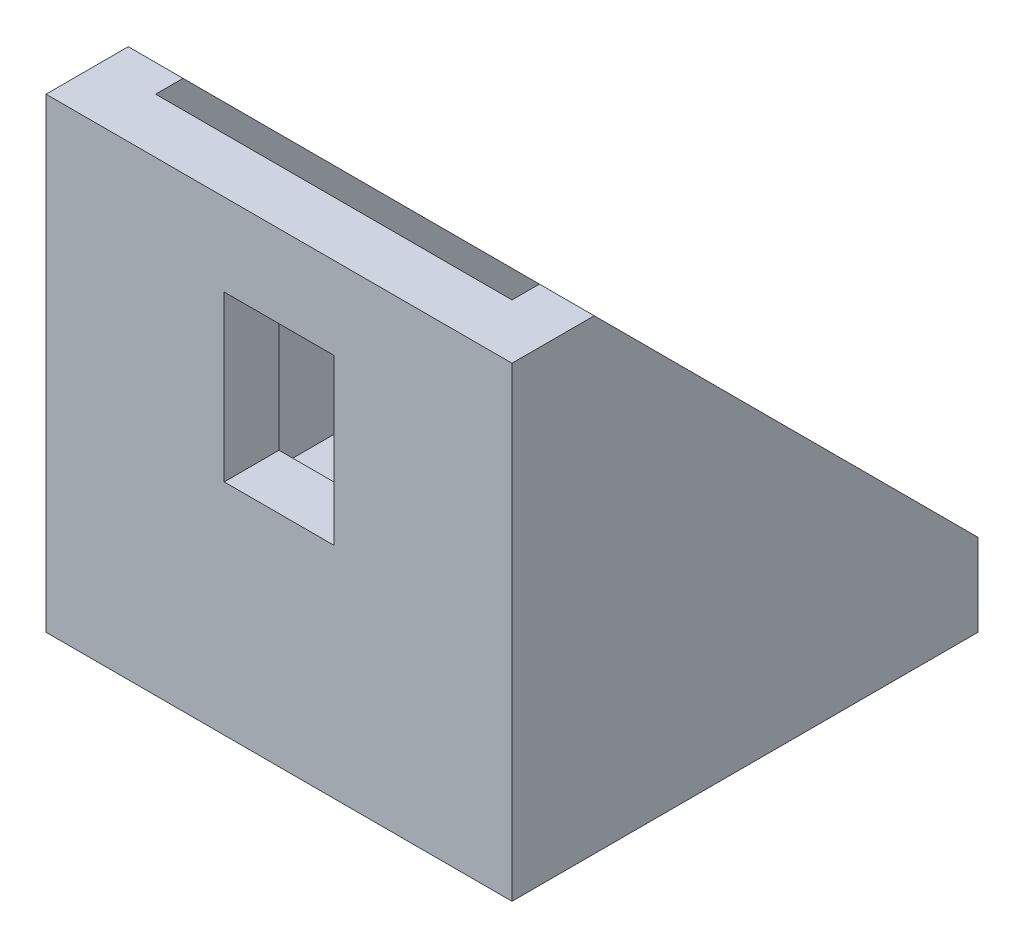
ISO-10303-21;
HEADER;
FILE_DESCRIPTION(('STEP AP214'),'2;1');
FILE_NAME('part.step','',(''),(''),'','','');
FILE_SCHEMA(('AUTOMOTIVE_DESIGN { 1 0 10303 214 1 1 1 1 }'));
ENDSEC;
DATA;
#1=APPLICATION_CONTEXT('core data for automotive mechanical design processes');
#2=APPLICATION_PROTOCOL_DEFINITION('international standard','automotive_design',2000,#1);
#3=PRODUCT_CONTEXT('',#1,'mechanical');
#4=PRODUCT('Part','Part','',(#3));
#5=PRODUCT_RELATED_PRODUCT_CATEGORY('part','',(#4));
#6=PRODUCT_DEFINITION_FORMATION('','',#4);
#7=PRODUCT_DEFINITION_CONTEXT('part definition',#1,'design');
#8=PRODUCT_DEFINITION('design','',#6,#7);
#9=PRODUCT_DEFINITION_SHAPE('','',#8);
#10=(LENGTH_UNIT() NAMED_UNIT(*) SI_UNIT(.MILLI.,.METRE.));
#11=(NAMED_UNIT(*) PLANE_ANGLE_UNIT() SI_UNIT($,.RADIAN.));
#12=(NAMED_UNIT(*) SI_UNIT($,.STERADIAN.) SOLID_ANGLE_UNIT());
#13=UNCERTAINTY_MEASURE_WITH_UNIT(LENGTH_MEASURE(1.E-05),#10,'distance_accuracy_value','');
#14=(GEOMETRIC_REPRESENTATION_CONTEXT(3) GLOBAL_UNCERTAINTY_ASSIGNED_CONTEXT((#13)) GLOBAL_UNIT_ASSIGNED_CONTEXT((#10,
#11,#12)) REPRESENTATION_CONTEXT('',''));
#15=CARTESIAN_POINT('',(0.,0.,0.));
#16=DIRECTION('',(0.,0.,1.));
#17=DIRECTION('',(1.,0.,0.));
#18=AXIS2_PLACEMENT_3D('',#15,#16,#17);
#19=CARTESIAN_POINT('',(8.5,3.,-17.));
#20=DIRECTION('',(0.,-0.707106781186547,0.707106781186548));
#21=DIRECTION('',(0.,-0.707106781186548,-0.707106781186547));
#22=AXIS2_PLACEMENT_3D('',#19,#20,#21);
#23=PLANE('',#22);
#24=DIRECTION('',(-1.,0.,0.));
#25=VECTOR('',#24,1.);
#26=CARTESIAN_POINT('',(8.5,3.,-17.));
#27=LINE('',#26,#25);
#28=CARTESIAN_POINT('',(8.5,3.,-17.));
#29=VERTEX_POINT('',#28);
#30=CARTESIAN_POINT('',(6.5,3.,-17.));
#31=VERTEX_POINT('',#30);
#32=EDGE_CURVE('E325',#29,#31,#27,.T.);
#33=ORIENTED_EDGE('',*,*,#32,.T.);
#34=DIRECTION('',(0.,0.707106781186548,0.707106781186547));
#35=VECTOR('',#34,1.);
#36=CARTESIAN_POINT('',(6.5,3.,-17.));
#37=LINE('',#36,#35);
#38=CARTESIAN_POINT('',(6.5,17.,-3.));
#39=VERTEX_POINT('',#38);
#40=EDGE_CURVE('E287',#31,#39,#37,.T.);
#41=ORIENTED_EDGE('',*,*,#40,.T.);
#42=DIRECTION('',(-1.,0.,0.));
#43=VECTOR('',#42,1.);
#44=CARTESIAN_POINT('',(8.5,17.,-3.));
#45=LINE('',#44,#43);
#46=CARTESIAN_POINT('',(8.5,17.,-3.));
#47=VERTEX_POINT('',#46);
#48=EDGE_CURVE('E12',#47,#39,#45,.T.);
#49=ORIENTED_EDGE('',*,*,#48,.F.);
#50=DIRECTION('',(0.,0.707106781186547,0.707106781186547));
#51=VECTOR('',#50,1.);
#52=CARTESIAN_POINT('',(8.5,3.,-17.));
#53=LINE('',#52,#51);
#54=EDGE_CURVE('E292',#29,#47,#53,.T.);
#55=ORIENTED_EDGE('',*,*,#54,.F.);
#56=EDGE_LOOP('',(#33,#41,#49,#55));
#57=FACE_BOUND('',#56,.T.);
#58=ADVANCED_FACE('F41',(#57),#23,.F.);
#59=CARTESIAN_POINT('',(-6.5,17.,-3.));
#60=VERTEX_POINT('',#59);
#61=CARTESIAN_POINT('',(-8.5,17.,-3.));
#62=VERTEX_POINT('',#61);
#63=EDGE_CURVE('E50',#60,#62,#45,.T.);
#64=ORIENTED_EDGE('',*,*,#63,.F.);
#65=DIRECTION('',(0.,-0.707106781186548,-0.707106781186547));
#66=VECTOR('',#65,1.);
#67=CARTESIAN_POINT('',(-6.5,3.,-17.));
#68=LINE('',#67,#66);
#69=CARTESIAN_POINT('',(-6.5,3.,-17.));
#70=VERTEX_POINT('',#69);
#71=EDGE_CURVE('E283',#60,#70,#68,.T.);
#72=ORIENTED_EDGE('',*,*,#71,.T.);
#73=CARTESIAN_POINT('',(-8.5,3.,-17.));
#74=VERTEX_POINT('',#73);
#75=EDGE_CURVE('E309',#70,#74,#27,.T.);
#76=ORIENTED_EDGE('',*,*,#75,.T.);
#77=DIRECTION('',(0.,0.707106781186547,0.707106781186547));
#78=VECTOR('',#77,1.);
#79=CARTESIAN_POINT('',(-8.5,3.,-17.));
#80=LINE('',#79,#78);
#81=EDGE_CURVE('E291',#74,#62,#80,.T.);
#82=ORIENTED_EDGE('',*,*,#81,.T.);
#83=EDGE_LOOP('',(#64,#72,#76,#82));
#84=FACE_BOUND('',#83,.T.);
#85=ADVANCED_FACE('F43',(#84),#23,.F.);
#86=CARTESIAN_POINT('',(8.5,17.,-3.));
#87=DIRECTION('',(0.,-1.,0.));
#88=DIRECTION('',(0.,0.,-1.));
#89=AXIS2_PLACEMENT_3D('',#86,#87,#88);
#90=PLANE('',#89);
#91=ORIENTED_EDGE('',*,*,#48,.T.);
#92=DIRECTION('',(0.,0.,-1.));
#93=VECTOR('',#92,1.);
#94=CARTESIAN_POINT('',(6.5,17.,19.1049731745428));
#95=LINE('',#94,#93);
#96=CARTESIAN_POINT('',(6.5,17.,-2.));
#97=VERTEX_POINT('',#96);
#98=EDGE_CURVE('E258',#97,#39,#95,.T.);
#99=ORIENTED_EDGE('',*,*,#98,.F.);
#100=DIRECTION('',(-1.,0.,0.));
#101=VECTOR('',#100,1.);
#102=CARTESIAN_POINT('',(6.5,17.,-2.));
#103=LINE('',#102,#101);
#104=CARTESIAN_POINT('',(-6.5,17.,-2.));
#105=VERTEX_POINT('',#104);
#106=EDGE_CURVE('E257',#97,#105,#103,.T.);
#107=ORIENTED_EDGE('',*,*,#106,.T.);
#108=DIRECTION('',(0.,0.,-1.));
#109=VECTOR('',#108,1.);
#110=CARTESIAN_POINT('',(-6.5,17.,19.1049731745428));
#111=LINE('',#110,#109);
#112=EDGE_CURVE('E272',#105,#60,#111,.T.);
#113=ORIENTED_EDGE('',*,*,#112,.T.);
#114=ORIENTED_EDGE('',*,*,#63,.T.);
#115=DIRECTION('',(0.,0.,1.));
#116=VECTOR('',#115,1.);
#117=CARTESIAN_POINT('',(-8.5,17.,-3.));
#118=LINE('',#117,#116);
#119=CARTESIAN_POINT('',(-8.5,17.,0.));
#120=VERTEX_POINT('',#119);
#121=EDGE_CURVE('E313',#62,#120,#118,.T.);
#122=ORIENTED_EDGE('',*,*,#121,.T.);
#123=DIRECTION('',(-1.,0.,0.));
#124=VECTOR('',#123,1.);
#125=CARTESIAN_POINT('',(8.5,17.,0.));
#126=LINE('',#125,#124);
#127=CARTESIAN_POINT('',(8.5,17.,0.));
#128=VERTEX_POINT('',#127);
#129=EDGE_CURVE('E336',#128,#120,#126,.T.);
#130=ORIENTED_EDGE('',*,*,#129,.F.);
#131=DIRECTION('',(0.,0.,1.));
#132=VECTOR('',#131,1.);
#133=CARTESIAN_POINT('',(8.5,17.,-3.));
#134=LINE('',#133,#132);
#135=EDGE_CURVE('E296',#47,#128,#134,.T.);
#136=ORIENTED_EDGE('',*,*,#135,.F.);
#137=EDGE_LOOP('',(#91,#99,#107,#113,#114,#122,#130,#136));
#138=FACE_BOUND('',#137,.T.);
#139=ADVANCED_FACE('F347',(#138),#90,.F.);
#140=CARTESIAN_POINT('',(8.5,17.,0.));
#141=DIRECTION('',(0.,0.,-1.));
#142=DIRECTION('',(0.,1.,0.));
#143=AXIS2_PLACEMENT_3D('',#140,#141,#142);
#144=PLANE('',#143);
#145=DIRECTION('',(-1.,0.,0.));
#146=VECTOR('',#145,1.);
#147=CARTESIAN_POINT('',(-2.,8.,0.));
#148=LINE('',#147,#146);
#149=CARTESIAN_POINT('',(2.,8.,0.));
#150=VERTEX_POINT('',#149);
#151=CARTESIAN_POINT('',(-2.,8.,0.));
#152=VERTEX_POINT('',#151);
#153=EDGE_CURVE('E223',#150,#152,#148,.T.);
#154=ORIENTED_EDGE('',*,*,#153,.T.);
#155=DIRECTION('',(0.,1.,0.));
#156=VECTOR('',#155,1.);
#157=CARTESIAN_POINT('',(-2.,8.,0.));
#158=LINE('',#157,#156);
#159=CARTESIAN_POINT('',(-2.,14.,0.));
#160=VERTEX_POINT('',#159);
#161=EDGE_CURVE('E210',#152,#160,#158,.T.);
#162=ORIENTED_EDGE('',*,*,#161,.T.);
#163=DIRECTION('',(1.,0.,0.));
#164=VECTOR('',#163,1.);
#165=CARTESIAN_POINT('',(-2.,14.,0.));
#166=LINE('',#165,#164);
#167=CARTESIAN_POINT('',(2.,14.,0.));
#168=VERTEX_POINT('',#167);
#169=EDGE_CURVE('E214',#160,#168,#166,.T.);
#170=ORIENTED_EDGE('',*,*,#169,.T.);
#171=DIRECTION('',(0.,-1.,0.));
#172=VECTOR('',#171,1.);
#173=CARTESIAN_POINT('',(2.,8.,0.));
#174=LINE('',#173,#172);
#175=EDGE_CURVE('E219',#168,#150,#174,.T.);
#176=ORIENTED_EDGE('',*,*,#175,.T.);
#177=EDGE_LOOP('',(#154,#162,#170,#176));
#178=FACE_BOUND('',#177,.T.);
#179=DIRECTION('',(0.,-1.,0.));
#180=VECTOR('',#179,1.);
#181=CARTESIAN_POINT('',(-8.5,17.,0.));
#182=LINE('',#181,#180);
#183=CARTESIAN_POINT('',(-8.5,0.,0.));
#184=VERTEX_POINT('',#183);
#185=EDGE_CURVE('E316',#120,#184,#182,.T.);
#186=ORIENTED_EDGE('',*,*,#185,.T.);
#187=DIRECTION('',(-1.,0.,0.));
#188=VECTOR('',#187,1.);
#189=CARTESIAN_POINT('',(8.5,0.,0.));
#190=LINE('',#189,#188);
#191=CARTESIAN_POINT('',(8.5,0.,0.));
#192=VERTEX_POINT('',#191);
#193=EDGE_CURVE('E333',#192,#184,#190,.T.);
#194=ORIENTED_EDGE('',*,*,#193,.F.);
#195=DIRECTION('',(0.,-1.,0.));
#196=VECTOR('',#195,1.);
#197=CARTESIAN_POINT('',(8.5,17.,0.));
#198=LINE('',#197,#196);
#199=EDGE_CURVE('E300',#128,#192,#198,.T.);
#200=ORIENTED_EDGE('',*,*,#199,.F.);
#201=ORIENTED_EDGE('',*,*,#129,.T.);
#202=EDGE_LOOP('',(#186,#194,#200,#201));
#203=FACE_BOUND('',#202,.T.);
#204=ADVANCED_FACE('F366',(#178,#203),#144,.F.);
#205=CARTESIAN_POINT('',(8.5,0.,0.));
#206=DIRECTION('',(0.,1.,0.));
#207=DIRECTION('',(0.,0.,1.));
#208=AXIS2_PLACEMENT_3D('',#205,#206,#207);
#209=PLANE('',#208);
#210=DIRECTION('',(-1.,0.,0.));
#211=VECTOR('',#210,1.);
#212=CARTESIAN_POINT('',(8.5,0.,-14.));
#213=LINE('',#212,#211);
#214=CARTESIAN_POINT('',(2.,0.,-14.));
#215=VERTEX_POINT('',#214);
#216=CARTESIAN_POINT('',(-2.,0.,-14.));
#217=VERTEX_POINT('',#216);
#218=EDGE_CURVE('E201',#215,#217,#213,.T.);
#219=ORIENTED_EDGE('',*,*,#218,.T.);
#220=DIRECTION('',(0.,0.,1.));
#221=VECTOR('',#220,1.);
#222=CARTESIAN_POINT('',(-2.,0.,0.));
#223=LINE('',#222,#221);
#224=CARTESIAN_POINT('',(-2.,0.,-8.));
#225=VERTEX_POINT('',#224);
#226=EDGE_CURVE('E205',#217,#225,#223,.T.);
#227=ORIENTED_EDGE('',*,*,#226,.T.);
#228=DIRECTION('',(1.,0.,0.));
#229=VECTOR('',#228,1.);
#230=CARTESIAN_POINT('',(8.5,0.,-8.));
#231=LINE('',#230,#229);
#232=CARTESIAN_POINT('',(2.,0.,-8.));
#233=VERTEX_POINT('',#232);
#234=EDGE_CURVE('E192',#225,#233,#231,.T.);
#235=ORIENTED_EDGE('',*,*,#234,.T.);
#236=DIRECTION('',(0.,0.,-1.));
#237=VECTOR('',#236,1.);
#238=CARTESIAN_POINT('',(2.,0.,0.));
#239=LINE('',#238,#237);
#240=EDGE_CURVE('E167',#233,#215,#239,.T.);
#241=ORIENTED_EDGE('',*,*,#240,.T.);
#242=EDGE_LOOP('',(#219,#227,#235,#241));
#243=FACE_BOUND('',#242,.T.);
#244=DIRECTION('',(0.,0.,-1.));
#245=VECTOR('',#244,1.);
#246=CARTESIAN_POINT('',(-8.5,0.,0.));
#247=LINE('',#246,#245);
#248=CARTESIAN_POINT('',(-8.5,0.,-17.));
#249=VERTEX_POINT('',#248);
#250=EDGE_CURVE('E319',#184,#249,#247,.T.);
#251=ORIENTED_EDGE('',*,*,#250,.T.);
#252=DIRECTION('',(-1.,0.,0.));
#253=VECTOR('',#252,1.);
#254=CARTESIAN_POINT('',(8.5,0.,-17.));
#255=LINE('',#254,#253);
#256=CARTESIAN_POINT('',(8.5,0.,-17.));
#257=VERTEX_POINT('',#256);
#258=EDGE_CURVE('E329',#257,#249,#255,.T.);
#259=ORIENTED_EDGE('',*,*,#258,.F.);
#260=DIRECTION('',(0.,0.,-1.));
#261=VECTOR('',#260,1.);
#262=CARTESIAN_POINT('',(8.5,0.,0.));
#263=LINE('',#262,#261);
#264=EDGE_CURVE('E303',#192,#257,#263,.T.);
#265=ORIENTED_EDGE('',*,*,#264,.F.);
#266=ORIENTED_EDGE('',*,*,#193,.T.);
#267=EDGE_LOOP('',(#251,#259,#265,#266));
#268=FACE_BOUND('',#267,.T.);
#269=ADVANCED_FACE('F363',(#243,#268),#209,.F.);
#270=CARTESIAN_POINT('',(8.5,0.,-17.));
#271=DIRECTION('',(0.,0.,1.));
#272=DIRECTION('',(1.,0.,0.));
#273=AXIS2_PLACEMENT_3D('',#270,#271,#272);
#274=PLANE('',#273);
#275=DIRECTION('',(0.,1.,0.));
#276=VECTOR('',#275,1.);
#277=CARTESIAN_POINT('',(-8.5,0.,-17.));
#278=LINE('',#277,#276);
#279=EDGE_CURVE('E297',#249,#74,#278,.T.);
#280=ORIENTED_EDGE('',*,*,#279,.T.);
#281=ORIENTED_EDGE('',*,*,#75,.F.);
#282=DIRECTION('',(-1.,0.,0.));
#283=VECTOR('',#282,1.);
#284=CARTESIAN_POINT('',(6.5,3.,-17.));
#285=LINE('',#284,#283);
#286=EDGE_CURVE('E244',#31,#70,#285,.T.);
#287=ORIENTED_EDGE('',*,*,#286,.F.);
#288=ORIENTED_EDGE('',*,*,#32,.F.);
#289=DIRECTION('',(0.,1.,0.));
#290=VECTOR('',#289,1.);
#291=CARTESIAN_POINT('',(8.5,0.,-17.));
#292=LINE('',#291,#290);
#293=EDGE_CURVE('E306',#257,#29,#292,.T.);
#294=ORIENTED_EDGE('',*,*,#293,.F.);
#295=ORIENTED_EDGE('',*,*,#258,.T.);
#296=EDGE_LOOP('',(#280,#281,#287,#288,#294,#295));
#297=FACE_BOUND('',#296,.T.);
#298=ADVANCED_FACE('F359',(#297),#274,.F.);
#299=CARTESIAN_POINT('',(8.5,0.,0.));
#300=DIRECTION('',(1.,0.,0.));
#301=DIRECTION('',(0.,0.,-1.));
#302=AXIS2_PLACEMENT_3D('',#299,#300,#301);
#303=PLANE('',#302);
#304=ORIENTED_EDGE('',*,*,#54,.T.);
#305=ORIENTED_EDGE('',*,*,#135,.T.);
#306=ORIENTED_EDGE('',*,*,#199,.T.);
#307=ORIENTED_EDGE('',*,*,#264,.T.);
#308=ORIENTED_EDGE('',*,*,#293,.T.);
#309=EDGE_LOOP('',(#304,#305,#306,#307,#308));
#310=FACE_BOUND('',#309,.T.);
#311=ADVANCED_FACE('F368',(#310),#303,.T.);
#312=CARTESIAN_POINT('',(-8.5,0.,0.));
#313=DIRECTION('',(1.,0.,0.));
#314=DIRECTION('',(0.,0.,-1.));
#315=AXIS2_PLACEMENT_3D('',#312,#313,#314);
#316=PLANE('',#315);
#317=ORIENTED_EDGE('',*,*,#81,.F.);
#318=ORIENTED_EDGE('',*,*,#279,.F.);
#319=ORIENTED_EDGE('',*,*,#250,.F.);
#320=ORIENTED_EDGE('',*,*,#185,.F.);
#321=ORIENTED_EDGE('',*,*,#121,.F.);
#322=EDGE_LOOP('',(#317,#318,#319,#320,#321));
#323=FACE_BOUND('',#322,.T.);
#324=ADVANCED_FACE('F352',(#323),#316,.F.);
#325=CARTESIAN_POINT('',(6.5,3.,19.1049731745428));
#326=DIRECTION('',(1.,0.,0.));
#327=DIRECTION('',(0.,0.,-1.));
#328=AXIS2_PLACEMENT_3D('',#325,#326,#327);
#329=PLANE('',#328);
#330=DIRECTION('',(0.,0.,-1.));
#331=VECTOR('',#330,1.);
#332=CARTESIAN_POINT('',(6.5,3.,19.1049731745428));
#333=LINE('',#332,#331);
#334=CARTESIAN_POINT('',(6.5,3.,-2.));
#335=VERTEX_POINT('',#334);
#336=EDGE_CURVE('E269',#335,#31,#333,.T.);
#337=ORIENTED_EDGE('',*,*,#336,.F.);
#338=DIRECTION('',(0.,1.,0.));
#339=VECTOR('',#338,1.);
#340=CARTESIAN_POINT('',(6.5,3.,-2.));
#341=LINE('',#340,#339);
#342=EDGE_CURVE('E262',#335,#97,#341,.T.);
#343=ORIENTED_EDGE('',*,*,#342,.T.);
#344=ORIENTED_EDGE('',*,*,#98,.T.);
#345=ORIENTED_EDGE('',*,*,#40,.F.);
#346=EDGE_LOOP('',(#337,#343,#344,#345));
#347=FACE_BOUND('',#346,.T.);
#348=ADVANCED_FACE('F377',(#347),#329,.F.);
#349=CARTESIAN_POINT('',(-6.5,3.,19.1049731745428));
#350=DIRECTION('',(-1.,0.,0.));
#351=DIRECTION('',(0.,0.,1.));
#352=AXIS2_PLACEMENT_3D('',#349,#350,#351);
#353=PLANE('',#352);
#354=ORIENTED_EDGE('',*,*,#112,.F.);
#355=DIRECTION('',(0.,-1.,0.));
#356=VECTOR('',#355,1.);
#357=CARTESIAN_POINT('',(-6.5,3.,-2.));
#358=LINE('',#357,#356);
#359=CARTESIAN_POINT('',(-6.5,3.,-2.));
#360=VERTEX_POINT('',#359);
#361=EDGE_CURVE('E254',#105,#360,#358,.T.);
#362=ORIENTED_EDGE('',*,*,#361,.T.);
#363=DIRECTION('',(0.,0.,-1.));
#364=VECTOR('',#363,1.);
#365=CARTESIAN_POINT('',(-6.5,3.,19.1049731745428));
#366=LINE('',#365,#364);
#367=EDGE_CURVE('E276',#360,#70,#366,.T.);
#368=ORIENTED_EDGE('',*,*,#367,.T.);
#369=ORIENTED_EDGE('',*,*,#71,.F.);
#370=EDGE_LOOP('',(#354,#362,#368,#369));
#371=FACE_BOUND('',#370,.T.);
#372=ADVANCED_FACE('F385',(#371),#353,.F.);
#373=CARTESIAN_POINT('',(6.5,3.,19.1049731745428));
#374=DIRECTION('',(0.,-1.,0.));
#375=DIRECTION('',(0.,0.,-1.));
#376=AXIS2_PLACEMENT_3D('',#373,#374,#375);
#377=PLANE('',#376);
#378=DIRECTION('',(1.,0.,0.));
#379=VECTOR('',#378,1.);
#380=CARTESIAN_POINT('',(-2.,3.,-8.));
#381=LINE('',#380,#379);
#382=CARTESIAN_POINT('',(-2.,3.,-8.));
#383=VERTEX_POINT('',#382);
#384=CARTESIAN_POINT('',(2.,3.,-8.));
#385=VERTEX_POINT('',#384);
#386=EDGE_CURVE('E174',#383,#385,#381,.T.);
#387=ORIENTED_EDGE('',*,*,#386,.F.);
#388=DIRECTION('',(0.,0.,1.));
#389=VECTOR('',#388,1.);
#390=CARTESIAN_POINT('',(-2.,3.,-8.));
#391=LINE('',#390,#389);
#392=CARTESIAN_POINT('',(-2.,3.,-14.));
#393=VERTEX_POINT('',#392);
#394=EDGE_CURVE('E65',#393,#383,#391,.T.);
#395=ORIENTED_EDGE('',*,*,#394,.F.);
#396=DIRECTION('',(-1.,0.,0.));
#397=VECTOR('',#396,1.);
#398=CARTESIAN_POINT('',(-2.,3.,-14.));
#399=LINE('',#398,#397);
#400=CARTESIAN_POINT('',(2.,3.,-14.));
#401=VERTEX_POINT('',#400);
#402=EDGE_CURVE('E182',#401,#393,#399,.T.);
#403=ORIENTED_EDGE('',*,*,#402,.F.);
#404=DIRECTION('',(0.,0.,-1.));
#405=VECTOR('',#404,1.);
#406=CARTESIAN_POINT('',(2.,3.,-8.));
#407=LINE('',#406,#405);
#408=EDGE_CURVE('E164',#385,#401,#407,.T.);
#409=ORIENTED_EDGE('',*,*,#408,.F.);
#410=EDGE_LOOP('',(#387,#395,#403,#409));
#411=FACE_BOUND('',#410,.T.);
#412=DIRECTION('',(1.,0.,0.));
#413=VECTOR('',#412,1.);
#414=CARTESIAN_POINT('',(6.5,3.,-2.));
#415=LINE('',#414,#413);
#416=EDGE_CURVE('E265',#360,#335,#415,.T.);
#417=ORIENTED_EDGE('',*,*,#416,.T.);
#418=ORIENTED_EDGE('',*,*,#336,.T.);
#419=ORIENTED_EDGE('',*,*,#286,.T.);
#420=ORIENTED_EDGE('',*,*,#367,.F.);
#421=EDGE_LOOP('',(#417,#418,#419,#420));
#422=FACE_BOUND('',#421,.T.);
#423=ADVANCED_FACE('F179',(#411,#422),#377,.F.);
#424=CARTESIAN_POINT('',(8.5,17.,-2.));
#425=DIRECTION('',(0.,0.,-1.));
#426=DIRECTION('',(0.,1.,0.));
#427=AXIS2_PLACEMENT_3D('',#424,#425,#426);
#428=PLANE('',#427);
#429=DIRECTION('',(0.,1.,0.));
#430=VECTOR('',#429,1.);
#431=CARTESIAN_POINT('',(-2.,8.,-2.));
#432=LINE('',#431,#430);
#433=CARTESIAN_POINT('',(-2.,8.,-2.));
#434=VERTEX_POINT('',#433);
#435=CARTESIAN_POINT('',(-2.,14.,-2.));
#436=VERTEX_POINT('',#435);
#437=EDGE_CURVE('E209',#434,#436,#432,.T.);
#438=ORIENTED_EDGE('',*,*,#437,.F.);
#439=DIRECTION('',(-1.,0.,0.));
#440=VECTOR('',#439,1.);
#441=CARTESIAN_POINT('',(-2.,8.,-2.));
#442=LINE('',#441,#440);
#443=CARTESIAN_POINT('',(2.,8.,-2.));
#444=VERTEX_POINT('',#443);
#445=EDGE_CURVE('E215',#444,#434,#442,.T.);
#446=ORIENTED_EDGE('',*,*,#445,.F.);
#447=DIRECTION('',(0.,-1.,0.));
#448=VECTOR('',#447,1.);
#449=CARTESIAN_POINT('',(2.,8.,-2.));
#450=LINE('',#449,#448);
#451=CARTESIAN_POINT('',(2.,14.,-2.));
#452=VERTEX_POINT('',#451);
#453=EDGE_CURVE('E234',#452,#444,#450,.T.);
#454=ORIENTED_EDGE('',*,*,#453,.F.);
#455=DIRECTION('',(1.,0.,0.));
#456=VECTOR('',#455,1.);
#457=CARTESIAN_POINT('',(-2.,14.,-2.));
#458=LINE('',#457,#456);
#459=EDGE_CURVE('E230',#436,#452,#458,.T.);
#460=ORIENTED_EDGE('',*,*,#459,.F.);
#461=EDGE_LOOP('',(#438,#446,#454,#460));
#462=FACE_BOUND('',#461,.T.);
#463=ORIENTED_EDGE('',*,*,#342,.F.);
#464=ORIENTED_EDGE('',*,*,#416,.F.);
#465=ORIENTED_EDGE('',*,*,#361,.F.);
#466=ORIENTED_EDGE('',*,*,#106,.F.);
#467=EDGE_LOOP('',(#463,#464,#465,#466));
#468=FACE_BOUND('',#467,.T.);
#469=ADVANCED_FACE('F383',(#462,#468),#428,.T.);
#470=CARTESIAN_POINT('',(-2.,8.,0.));
#471=DIRECTION('',(-1.,0.,0.));
#472=DIRECTION('',(0.,0.,1.));
#473=AXIS2_PLACEMENT_3D('',#470,#471,#472);
#474=PLANE('',#473);
#475=ORIENTED_EDGE('',*,*,#437,.T.);
#476=DIRECTION('',(0.,0.,-1.));
#477=VECTOR('',#476,1.);
#478=CARTESIAN_POINT('',(-2.,14.,0.));
#479=LINE('',#478,#477);
#480=EDGE_CURVE('E227',#160,#436,#479,.T.);
#481=ORIENTED_EDGE('',*,*,#480,.F.);
#482=ORIENTED_EDGE('',*,*,#161,.F.);
#483=DIRECTION('',(0.,0.,-1.));
#484=VECTOR('',#483,1.);
#485=CARTESIAN_POINT('',(-2.,8.,0.));
#486=LINE('',#485,#484);
#487=EDGE_CURVE('E241',#152,#434,#486,.T.);
#488=ORIENTED_EDGE('',*,*,#487,.T.);
#489=EDGE_LOOP('',(#475,#481,#482,#488));
#490=FACE_BOUND('',#489,.T.);
#491=ADVANCED_FACE('F453',(#490),#474,.F.);
#492=CARTESIAN_POINT('',(-2.,8.,0.));
#493=DIRECTION('',(0.,-1.,0.));
#494=DIRECTION('',(1.,0.,0.));
#495=AXIS2_PLACEMENT_3D('',#492,#493,#494);
#496=PLANE('',#495);
#497=ORIENTED_EDGE('',*,*,#445,.T.);
#498=ORIENTED_EDGE('',*,*,#487,.F.);
#499=ORIENTED_EDGE('',*,*,#153,.F.);
#500=DIRECTION('',(0.,0.,-1.));
#501=VECTOR('',#500,1.);
#502=CARTESIAN_POINT('',(2.,8.,0.));
#503=LINE('',#502,#501);
#504=EDGE_CURVE('E245',#150,#444,#503,.T.);
#505=ORIENTED_EDGE('',*,*,#504,.T.);
#506=EDGE_LOOP('',(#497,#498,#499,#505));
#507=FACE_BOUND('',#506,.T.);
#508=ADVANCED_FACE('F462',(#507),#496,.F.);
#509=CARTESIAN_POINT('',(2.,8.,0.));
#510=DIRECTION('',(1.,0.,0.));
#511=DIRECTION('',(0.,0.,-1.));
#512=AXIS2_PLACEMENT_3D('',#509,#510,#511);
#513=PLANE('',#512);
#514=ORIENTED_EDGE('',*,*,#453,.T.);
#515=ORIENTED_EDGE('',*,*,#504,.F.);
#516=ORIENTED_EDGE('',*,*,#175,.F.);
#517=DIRECTION('',(0.,0.,-1.));
#518=VECTOR('',#517,1.);
#519=CARTESIAN_POINT('',(2.,14.,0.));
#520=LINE('',#519,#518);
#521=EDGE_CURVE('E248',#168,#452,#520,.T.);
#522=ORIENTED_EDGE('',*,*,#521,.T.);
#523=EDGE_LOOP('',(#514,#515,#516,#522));
#524=FACE_BOUND('',#523,.T.);
#525=ADVANCED_FACE('F472',(#524),#513,.F.);
#526=CARTESIAN_POINT('',(-2.,14.,0.));
#527=DIRECTION('',(0.,1.,0.));
#528=DIRECTION('',(0.,0.,1.));
#529=AXIS2_PLACEMENT_3D('',#526,#527,#528);
#530=PLANE('',#529);
#531=ORIENTED_EDGE('',*,*,#459,.T.);
#532=ORIENTED_EDGE('',*,*,#521,.F.);
#533=ORIENTED_EDGE('',*,*,#169,.F.);
#534=ORIENTED_EDGE('',*,*,#480,.T.);
#535=EDGE_LOOP('',(#531,#532,#533,#534));
#536=FACE_BOUND('',#535,.T.);
#537=ADVANCED_FACE('F482',(#536),#530,.F.);
#538=CARTESIAN_POINT('',(-2.,-14.,-8.));
#539=DIRECTION('',(-1.,0.,0.));
#540=DIRECTION('',(0.,0.,1.));
#541=AXIS2_PLACEMENT_3D('',#538,#539,#540);
#542=PLANE('',#541);
#543=DIRECTION('',(0.,1.,0.));
#544=VECTOR('',#543,1.);
#545=CARTESIAN_POINT('',(-2.,-14.,-14.));
#546=LINE('',#545,#544);
#547=EDGE_CURVE('E189',#217,#393,#546,.T.);
#548=ORIENTED_EDGE('',*,*,#547,.T.);
#549=ORIENTED_EDGE('',*,*,#394,.T.);
#550=DIRECTION('',(0.,1.,0.));
#551=VECTOR('',#550,1.);
#552=CARTESIAN_POINT('',(-2.,-14.,-8.));
#553=LINE('',#552,#551);
#554=EDGE_CURVE('E171',#225,#383,#553,.T.);
#555=ORIENTED_EDGE('',*,*,#554,.F.);
#556=ORIENTED_EDGE('',*,*,#226,.F.);
#557=EDGE_LOOP('',(#548,#549,#555,#556));
#558=FACE_BOUND('',#557,.T.);
#559=ADVANCED_FACE('F492',(#558),#542,.F.);
#560=CARTESIAN_POINT('',(-2.,-14.,-14.));
#561=DIRECTION('',(0.,0.,-1.));
#562=DIRECTION('',(-1.,0.,0.));
#563=AXIS2_PLACEMENT_3D('',#560,#561,#562);
#564=PLANE('',#563);
#565=DIRECTION('',(0.,1.,0.));
#566=VECTOR('',#565,1.);
#567=CARTESIAN_POINT('',(2.,-14.,-14.));
#568=LINE('',#567,#566);
#569=EDGE_CURVE('E170',#215,#401,#568,.T.);
#570=ORIENTED_EDGE('',*,*,#569,.T.);
#571=ORIENTED_EDGE('',*,*,#402,.T.);
#572=ORIENTED_EDGE('',*,*,#547,.F.);
#573=ORIENTED_EDGE('',*,*,#218,.F.);
#574=EDGE_LOOP('',(#570,#571,#572,#573));
#575=FACE_BOUND('',#574,.T.);
#576=ADVANCED_FACE('F512',(#575),#564,.F.);
#577=CARTESIAN_POINT('',(2.,-14.,-8.));
#578=DIRECTION('',(1.,0.,0.));
#579=DIRECTION('',(0.,0.,-1.));
#580=AXIS2_PLACEMENT_3D('',#577,#578,#579);
#581=PLANE('',#580);
#582=DIRECTION('',(0.,1.,0.));
#583=VECTOR('',#582,1.);
#584=CARTESIAN_POINT('',(2.,-14.,-8.));
#585=LINE('',#584,#583);
#586=EDGE_CURVE('E57',#233,#385,#585,.T.);
#587=ORIENTED_EDGE('',*,*,#586,.T.);
#588=ORIENTED_EDGE('',*,*,#408,.T.);
#589=ORIENTED_EDGE('',*,*,#569,.F.);
#590=ORIENTED_EDGE('',*,*,#240,.F.);
#591=EDGE_LOOP('',(#587,#588,#589,#590));
#592=FACE_BOUND('',#591,.T.);
#593=ADVANCED_FACE('F161',(#592),#581,.F.);
#594=CARTESIAN_POINT('',(-2.,-14.,-8.));
#595=DIRECTION('',(0.,0.,1.));
#596=DIRECTION('',(1.,0.,0.));
#597=AXIS2_PLACEMENT_3D('',#594,#595,#596);
#598=PLANE('',#597);
#599=ORIENTED_EDGE('',*,*,#554,.T.);
#600=ORIENTED_EDGE('',*,*,#386,.T.);
#601=ORIENTED_EDGE('',*,*,#586,.F.);
#602=ORIENTED_EDGE('',*,*,#234,.F.);
#603=EDGE_LOOP('',(#599,#600,#601,#602));
#604=FACE_BOUND('',#603,.T.);
#605=ADVANCED_FACE('F175',(#604),#598,.F.);
#606=CLOSED_SHELL('',(#58,#85,#139,#204,#269,#298,#311,#324,#348,#372,#423,#469,#491,#508,#525,
#537,#559,#576,#593,#605));
#607=MANIFOLD_SOLID_BREP('B2',#606);
#608=ADVANCED_BREP_SHAPE_REPRESENTATION('',(#18,#607),#14);
#609=SHAPE_DEFINITION_REPRESENTATION(#9,#608);
ENDSEC;
END-ISO-10303-21;
